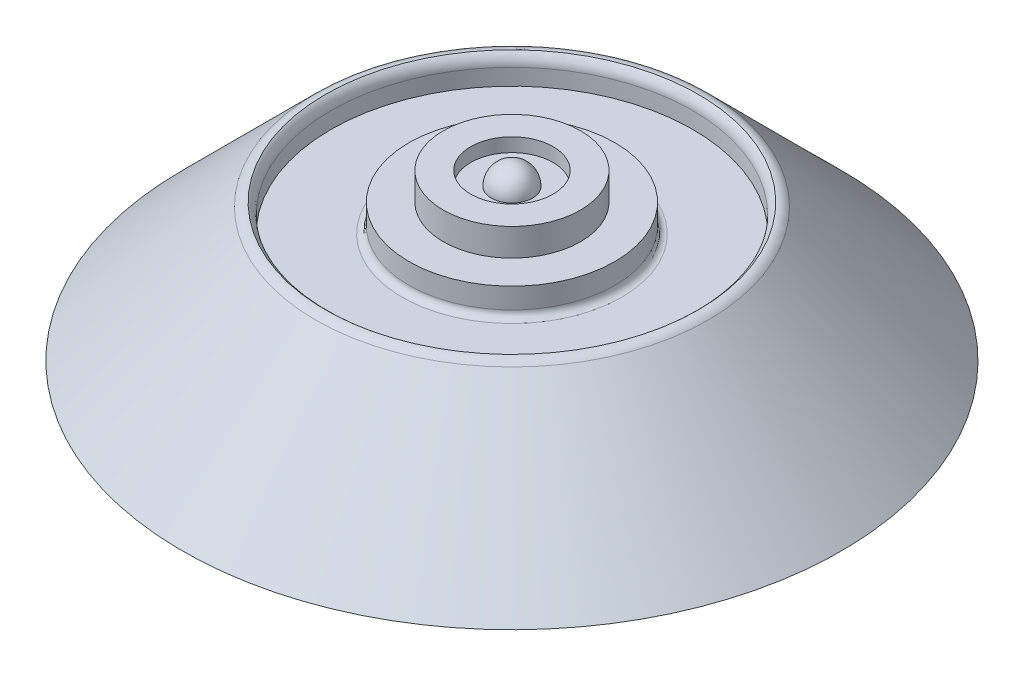
ISO-10303-21;
HEADER;
FILE_DESCRIPTION(('STEP AP214'),'2;1');
FILE_NAME('part.step','',(''),(''),'','','');
FILE_SCHEMA(('AUTOMOTIVE_DESIGN { 1 0 10303 214 1 1 1 1 }'));
ENDSEC;
DATA;
#1=APPLICATION_CONTEXT('core data for automotive mechanical design processes');
#2=APPLICATION_PROTOCOL_DEFINITION('international standard','automotive_design',2000,#1);
#3=PRODUCT_CONTEXT('',#1,'mechanical');
#4=PRODUCT('Part','Part','',(#3));
#5=PRODUCT_RELATED_PRODUCT_CATEGORY('part','',(#4));
#6=PRODUCT_DEFINITION_FORMATION('','',#4);
#7=PRODUCT_DEFINITION_CONTEXT('part definition',#1,'design');
#8=PRODUCT_DEFINITION('design','',#6,#7);
#9=PRODUCT_DEFINITION_SHAPE('','',#8);
#10=(LENGTH_UNIT() NAMED_UNIT(*) SI_UNIT(.MILLI.,.METRE.));
#11=(NAMED_UNIT(*) PLANE_ANGLE_UNIT() SI_UNIT($,.RADIAN.));
#12=(NAMED_UNIT(*) SI_UNIT($,.STERADIAN.) SOLID_ANGLE_UNIT());
#13=UNCERTAINTY_MEASURE_WITH_UNIT(LENGTH_MEASURE(1.E-05),#10,'distance_accuracy_value','');
#14=(GEOMETRIC_REPRESENTATION_CONTEXT(3) GLOBAL_UNCERTAINTY_ASSIGNED_CONTEXT((#13)) GLOBAL_UNIT_ASSIGNED_CONTEXT((#10,
#11,#12)) REPRESENTATION_CONTEXT('',''));
#15=CARTESIAN_POINT('',(0.,0.,0.));
#16=DIRECTION('',(0.,0.,1.));
#17=DIRECTION('',(1.,0.,0.));
#18=AXIS2_PLACEMENT_3D('',#15,#16,#17);
#19=CARTESIAN_POINT('',(0.,-20.4513550011599,0.));
#20=DIRECTION('',(0.,1.,0.));
#21=DIRECTION('',(-1.,0.,0.));
#22=AXIS2_PLACEMENT_3D('',#19,#20,#21);
#23=PLANE('',#22);
#24=CARTESIAN_POINT('',(0.,-20.4513550011599,0.));
#25=DIRECTION('',(0.,1.,0.));
#26=DIRECTION('',(-1.,0.,0.));
#27=AXIS2_PLACEMENT_3D('',#24,#25,#26);
#28=CIRCLE('',#27,30.48);
#29=CARTESIAN_POINT('',(-30.4800000000001,-20.4513550011599,0.));
#30=VERTEX_POINT('',#29);
#31=EDGE_CURVE('E74',#30,#30,#28,.T.);
#32=ORIENTED_EDGE('',*,*,#31,.F.);
#33=EDGE_LOOP('',(#32));
#34=FACE_BOUND('',#33,.T.);
#35=ADVANCED_FACE('F48',(#34),#23,.F.);
#36=CARTESIAN_POINT('',(0.,-20.4513550011599,0.));
#37=DIRECTION('',(0.,-1.,0.));
#38=DIRECTION('',(1.,0.,0.));
#39=AXIS2_PLACEMENT_3D('',#36,#37,#38);
#40=CONICAL_SURFACE('',#39,30.48,0.785398163397448);
#41=CARTESIAN_POINT('',(0.,-8.12332938905294,0.));
#42=DIRECTION('',(0.,1.,0.));
#43=DIRECTION('',(-1.,0.,0.));
#44=AXIS2_PLACEMENT_3D('',#41,#42,#43);
#45=CIRCLE('',#44,18.1519743878931);
#46=CARTESIAN_POINT('',(-18.1519743878931,-8.12332938905294,0.));
#47=VERTEX_POINT('',#46);
#48=EDGE_CURVE('E68',#47,#47,#45,.F.);
#49=ORIENTED_EDGE('',*,*,#48,.T.);
#50=EDGE_LOOP('',(#49));
#51=FACE_BOUND('',#50,.T.);
#52=ORIENTED_EDGE('',*,*,#31,.T.);
#53=EDGE_LOOP('',(#52));
#54=FACE_BOUND('',#53,.T.);
#55=ADVANCED_FACE('F108',(#51,#54),#40,.T.);
#56=CARTESIAN_POINT('',(0.,-9.02135500115986,0.));
#57=DIRECTION('',(0.,-1.,0.));
#58=DIRECTION('',(1.,0.,0.));
#59=AXIS2_PLACEMENT_3D('',#56,#57,#58);
#60=TOROIDAL_SURFACE('',#59,17.2539487757862,1.27);
#61=ORIENTED_EDGE('',*,*,#48,.F.);
#62=EDGE_LOOP('',(#61));
#63=FACE_BOUND('',#62,.T.);
#64=CARTESIAN_POINT('',(0.,-7.75135500115987,0.));
#65=DIRECTION('',(0.,-1.,0.));
#66=DIRECTION('',(1.,0.,0.));
#67=AXIS2_PLACEMENT_3D('',#64,#65,#66);
#68=CIRCLE('',#67,17.2539487757862);
#69=CARTESIAN_POINT('',(17.2539487757862,-7.75135500115986,0.));
#70=VERTEX_POINT('',#69);
#71=EDGE_CURVE('E71',#70,#70,#68,.F.);
#72=ORIENTED_EDGE('',*,*,#71,.F.);
#73=EDGE_LOOP('',(#72));
#74=FACE_BOUND('',#73,.T.);
#75=ADVANCED_FACE('F114',(#63,#74),#60,.T.);
#76=CARTESIAN_POINT('',(0.,-10.2913550011599,0.));
#77=DIRECTION('',(0.,1.,0.));
#78=DIRECTION('',(-1.,0.,0.));
#79=AXIS2_PLACEMENT_3D('',#76,#77,#78);
#80=CYLINDRICAL_SURFACE('',#79,16.7278975515723);
#81=CARTESIAN_POINT('',(0.,-8.78064612567531,0.));
#82=DIRECTION('',(0.,1.,0.));
#83=DIRECTION('',(-1.,0.,0.));
#84=AXIS2_PLACEMENT_3D('',#81,#82,#83);
#85=CIRCLE('',#84,16.7278975515723);
#86=CARTESIAN_POINT('',(-16.7278975515724,-8.78064612567531,0.));
#87=VERTEX_POINT('',#86);
#88=EDGE_CURVE('E63',#87,#87,#85,.T.);
#89=ORIENTED_EDGE('',*,*,#88,.T.);
#90=EDGE_LOOP('',(#89));
#91=FACE_BOUND('',#90,.T.);
#92=CARTESIAN_POINT('',(0.,-10.2913550011599,0.));
#93=DIRECTION('',(0.,1.,0.));
#94=DIRECTION('',(-1.,0.,0.));
#95=AXIS2_PLACEMENT_3D('',#92,#93,#94);
#96=CIRCLE('',#95,16.7278975515723);
#97=CARTESIAN_POINT('',(-16.7278975515724,-10.2913550011599,0.));
#98=VERTEX_POINT('',#97);
#99=EDGE_CURVE('E77',#98,#98,#96,.T.);
#100=ORIENTED_EDGE('',*,*,#99,.F.);
#101=EDGE_LOOP('',(#100));
#102=FACE_BOUND('',#101,.T.);
#103=ADVANCED_FACE('F127',(#91,#102),#80,.F.);
#104=CARTESIAN_POINT('',(0.,-10.2913550011599,0.));
#105=DIRECTION('',(0.,1.,0.));
#106=DIRECTION('',(-1.,0.,0.));
#107=AXIS2_PLACEMENT_3D('',#104,#105,#106);
#108=PLANE('',#107);
#109=CARTESIAN_POINT('',(0.,-10.2913550011599,0.));
#110=DIRECTION('',(0.,1.,0.));
#111=DIRECTION('',(-1.,0.,0.));
#112=AXIS2_PLACEMENT_3D('',#109,#110,#111);
#113=CIRCLE('',#112,10.16);
#114=CARTESIAN_POINT('',(-10.16,-10.2913550011599,0.));
#115=VERTEX_POINT('',#114);
#116=EDGE_CURVE('E12',#115,#115,#113,.F.);
#117=ORIENTED_EDGE('',*,*,#116,.T.);
#118=EDGE_LOOP('',(#117));
#119=FACE_BOUND('',#118,.T.);
#120=ORIENTED_EDGE('',*,*,#99,.T.);
#121=EDGE_LOOP('',(#120));
#122=FACE_BOUND('',#121,.T.);
#123=ADVANCED_FACE('F144',(#119,#122),#108,.T.);
#124=CARTESIAN_POINT('',(0.,-10.2913550011599,0.));
#125=DIRECTION('',(0.,1.,0.));
#126=DIRECTION('',(-1.,0.,0.));
#127=AXIS2_PLACEMENT_3D('',#124,#125,#126);
#128=CYLINDRICAL_SURFACE('',#127,9.525);
#129=CARTESIAN_POINT('',(0.,-9.65635500115986,0.));
#130=DIRECTION('',(0.,1.,0.));
#131=DIRECTION('',(-1.,0.,0.));
#132=AXIS2_PLACEMENT_3D('',#129,#130,#131);
#133=CIRCLE('',#132,9.525);
#134=CARTESIAN_POINT('',(-9.52500000000001,-9.65635500115986,0.));
#135=VERTEX_POINT('',#134);
#136=EDGE_CURVE('E55',#135,#135,#133,.T.);
#137=ORIENTED_EDGE('',*,*,#136,.T.);
#138=EDGE_LOOP('',(#137));
#139=FACE_BOUND('',#138,.T.);
#140=CARTESIAN_POINT('',(0.,-7.75135500115987,0.));
#141=DIRECTION('',(0.,1.,0.));
#142=DIRECTION('',(-1.,0.,0.));
#143=AXIS2_PLACEMENT_3D('',#140,#141,#142);
#144=CIRCLE('',#143,9.525);
#145=CARTESIAN_POINT('',(-9.52500000000001,-7.75135500115987,0.));
#146=VERTEX_POINT('',#145);
#147=EDGE_CURVE('E80',#146,#146,#144,.T.);
#148=ORIENTED_EDGE('',*,*,#147,.F.);
#149=EDGE_LOOP('',(#148));
#150=FACE_BOUND('',#149,.T.);
#151=ADVANCED_FACE('F124',(#139,#150),#128,.T.);
#152=CARTESIAN_POINT('',(17.7800000000001,-7.75135500115987,0.));
#153=DIRECTION('',(0.,-1.,0.));
#154=DIRECTION('',(1.,0.,0.));
#155=AXIS2_PLACEMENT_3D('',#152,#153,#154);
#156=PLANE('',#155);
#157=CARTESIAN_POINT('',(0.,-7.75135500115987,0.));
#158=DIRECTION('',(0.,-1.,0.));
#159=DIRECTION('',(1.,0.,0.));
#160=AXIS2_PLACEMENT_3D('',#157,#158,#159);
#161=CIRCLE('',#160,6.35);
#162=CARTESIAN_POINT('',(6.35000000000004,-7.75135500115986,0.));
#163=VERTEX_POINT('',#162);
#164=EDGE_CURVE('E59',#163,#163,#161,.F.);
#165=ORIENTED_EDGE('',*,*,#164,.F.);
#166=EDGE_LOOP('',(#165));
#167=FACE_BOUND('',#166,.T.);
#168=ORIENTED_EDGE('',*,*,#147,.T.);
#169=EDGE_LOOP('',(#168));
#170=FACE_BOUND('',#169,.T.);
#171=ADVANCED_FACE('F120',(#167,#170),#156,.F.);
#172=CARTESIAN_POINT('',(0.,-8.78064612567531,0.));
#173=DIRECTION('',(0.,1.,0.));
#174=DIRECTION('',(-1.,0.,0.));
#175=AXIS2_PLACEMENT_3D('',#172,#173,#174);
#176=TOROIDAL_SURFACE('',#175,17.9978975515723,1.27);
#177=ORIENTED_EDGE('',*,*,#71,.T.);
#178=EDGE_LOOP('',(#177));
#179=FACE_BOUND('',#178,.T.);
#180=ORIENTED_EDGE('',*,*,#88,.F.);
#181=EDGE_LOOP('',(#180));
#182=FACE_BOUND('',#181,.T.);
#183=ADVANCED_FACE('F123',(#179,#182),#176,.T.);
#184=CARTESIAN_POINT('',(0.,-5.21135500115985,0.));
#185=DIRECTION('',(0.,-1.,0.));
#186=DIRECTION('',(1.,0.,0.));
#187=AXIS2_PLACEMENT_3D('',#184,#185,#186);
#188=CYLINDRICAL_SURFACE('',#187,6.35);
#189=CARTESIAN_POINT('',(0.,-5.21135500115985,0.));
#190=DIRECTION('',(0.,1.,0.));
#191=DIRECTION('',(-1.,0.,0.));
#192=AXIS2_PLACEMENT_3D('',#189,#190,#191);
#193=CIRCLE('',#192,6.35);
#194=CARTESIAN_POINT('',(-6.35,-5.21135500115985,0.));
#195=VERTEX_POINT('',#194);
#196=EDGE_CURVE('E83',#195,#195,#193,.T.);
#197=ORIENTED_EDGE('',*,*,#196,.F.);
#198=EDGE_LOOP('',(#197));
#199=FACE_BOUND('',#198,.T.);
#200=ORIENTED_EDGE('',*,*,#164,.T.);
#201=EDGE_LOOP('',(#200));
#202=FACE_BOUND('',#201,.T.);
#203=ADVANCED_FACE('F130',(#199,#202),#188,.T.);
#204=CARTESIAN_POINT('',(0.,-5.21135500115985,0.));
#205=DIRECTION('',(0.,1.,0.));
#206=DIRECTION('',(-1.,0.,0.));
#207=AXIS2_PLACEMENT_3D('',#204,#205,#206);
#208=PLANE('',#207);
#209=CARTESIAN_POINT('',(0.,-5.21135500115985,0.));
#210=DIRECTION('',(0.,1.,0.));
#211=DIRECTION('',(-1.,0.,0.));
#212=AXIS2_PLACEMENT_3D('',#209,#210,#211);
#213=CIRCLE('',#212,3.81);
#214=CARTESIAN_POINT('',(-3.80999999999999,-5.21135500115985,0.));
#215=VERTEX_POINT('',#214);
#216=EDGE_CURVE('E87',#215,#215,#213,.T.);
#217=ORIENTED_EDGE('',*,*,#216,.F.);
#218=EDGE_LOOP('',(#217));
#219=FACE_BOUND('',#218,.T.);
#220=ORIENTED_EDGE('',*,*,#196,.T.);
#221=EDGE_LOOP('',(#220));
#222=FACE_BOUND('',#221,.T.);
#223=ADVANCED_FACE('F135',(#219,#222),#208,.T.);
#224=CARTESIAN_POINT('',(0.,-6.48135500115987,0.));
#225=DIRECTION('',(0.,1.,0.));
#226=DIRECTION('',(-1.,0.,0.));
#227=AXIS2_PLACEMENT_3D('',#224,#225,#226);
#228=CYLINDRICAL_SURFACE('',#227,3.81);
#229=CARTESIAN_POINT('',(0.,-6.48135500115987,0.));
#230=DIRECTION('',(0.,1.,0.));
#231=DIRECTION('',(-1.,0.,0.));
#232=AXIS2_PLACEMENT_3D('',#229,#230,#231);
#233=CIRCLE('',#232,3.81);
#234=CARTESIAN_POINT('',(-3.80999999999999,-6.48135500115987,0.));
#235=VERTEX_POINT('',#234);
#236=EDGE_CURVE('E86',#235,#235,#233,.T.);
#237=ORIENTED_EDGE('',*,*,#236,.F.);
#238=EDGE_LOOP('',(#237));
#239=FACE_BOUND('',#238,.T.);
#240=ORIENTED_EDGE('',*,*,#216,.T.);
#241=EDGE_LOOP('',(#240));
#242=FACE_BOUND('',#241,.T.);
#243=ADVANCED_FACE('F156',(#239,#242),#228,.F.);
#244=CARTESIAN_POINT('',(0.,-6.48135500115987,0.));
#245=DIRECTION('',(0.,1.,0.));
#246=DIRECTION('',(-1.,0.,0.));
#247=AXIS2_PLACEMENT_3D('',#244,#245,#246);
#248=PLANE('',#247);
#249=CARTESIAN_POINT('',(0.,-6.48135500115987,0.));
#250=DIRECTION('',(0.,-1.,0.));
#251=DIRECTION('',(1.,0.,0.));
#252=AXIS2_PLACEMENT_3D('',#249,#250,#251);
#253=CIRCLE('',#252,1.905);
#254=CARTESIAN_POINT('',(1.90500000000003,-6.48135500115989,0.));
#255=VERTEX_POINT('',#254);
#256=EDGE_CURVE('E90',#255,#255,#253,.T.);
#257=ORIENTED_EDGE('',*,*,#256,.T.);
#258=EDGE_LOOP('',(#257));
#259=FACE_BOUND('',#258,.T.);
#260=ORIENTED_EDGE('',*,*,#236,.T.);
#261=EDGE_LOOP('',(#260));
#262=FACE_BOUND('',#261,.T.);
#263=ADVANCED_FACE('F96',(#259,#262),#248,.T.);
#264=CARTESIAN_POINT('',(0.,-9.65635500115986,0.));
#265=DIRECTION('',(0.,1.,0.));
#266=DIRECTION('',(-1.,0.,0.));
#267=AXIS2_PLACEMENT_3D('',#264,#265,#266);
#268=TOROIDAL_SURFACE('',#267,10.16,0.635);
#269=ORIENTED_EDGE('',*,*,#116,.F.);
#270=EDGE_LOOP('',(#269));
#271=FACE_BOUND('',#270,.T.);
#272=ORIENTED_EDGE('',*,*,#136,.F.);
#273=EDGE_LOOP('',(#272));
#274=FACE_BOUND('',#273,.T.);
#275=ADVANCED_FACE('F50',(#271,#274),#268,.F.);
#276=CARTESIAN_POINT('',(0.,-6.48135500115987,0.));
#277=DIRECTION('',(0.,0.,1.));
#278=DIRECTION('',(1.,0.,0.));
#279=AXIS2_PLACEMENT_3D('',#276,#277,#278);
#280=SPHERICAL_SURFACE('',#279,1.905);
#281=CARTESIAN_POINT('',(0.,-6.48135500115987,0.));
#282=DIRECTION('',(0.,-1.,0.));
#283=DIRECTION('',(1.,0.,0.));
#284=AXIS2_PLACEMENT_3D('',#281,#282,#283);
#285=SPHERICAL_SURFACE('',#284,1.905);
#286=ORIENTED_EDGE('',*,*,#256,.F.);
#287=EDGE_LOOP('',(#286));
#288=FACE_BOUND('',#287,.T.);
#289=ADVANCED_FACE('F99',(#288),#285,.T.);
#290=CLOSED_SHELL('',(#35,#55,#75,#103,#123,#151,#171,#183,#203,#223,#243,#263,#275,#289));
#291=MANIFOLD_SOLID_BREP('B2',#290);
#292=ADVANCED_BREP_SHAPE_REPRESENTATION('',(#18,#291),#14);
#293=SHAPE_DEFINITION_REPRESENTATION(#9,#292);
ENDSEC;
END-ISO-10303-21;
